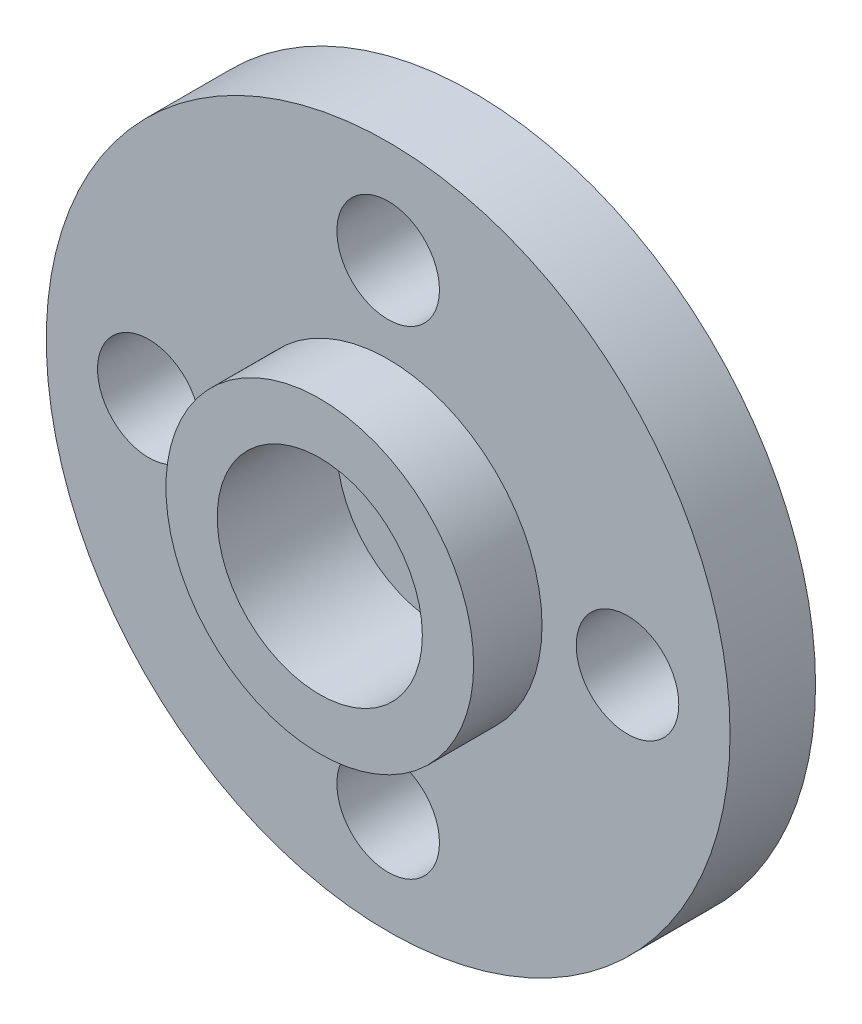
ISO-10303-21;
HEADER;
FILE_DESCRIPTION(('STEP AP214'),'2;1');
FILE_NAME('part.step','',(''),(''),'','','');
FILE_SCHEMA(('AUTOMOTIVE_DESIGN { 1 0 10303 214 1 1 1 1 }'));
ENDSEC;
DATA;
#1=APPLICATION_CONTEXT('core data for automotive mechanical design processes');
#2=APPLICATION_PROTOCOL_DEFINITION('international standard','automotive_design',2000,#1);
#3=PRODUCT_CONTEXT('',#1,'mechanical');
#4=PRODUCT('Part','Part','',(#3));
#5=PRODUCT_RELATED_PRODUCT_CATEGORY('part','',(#4));
#6=PRODUCT_DEFINITION_FORMATION('','',#4);
#7=PRODUCT_DEFINITION_CONTEXT('part definition',#1,'design');
#8=PRODUCT_DEFINITION('design','',#6,#7);
#9=PRODUCT_DEFINITION_SHAPE('','',#8);
#10=(LENGTH_UNIT() NAMED_UNIT(*) SI_UNIT(.MILLI.,.METRE.));
#11=(NAMED_UNIT(*) PLANE_ANGLE_UNIT() SI_UNIT($,.RADIAN.));
#12=(NAMED_UNIT(*) SI_UNIT($,.STERADIAN.) SOLID_ANGLE_UNIT());
#13=UNCERTAINTY_MEASURE_WITH_UNIT(LENGTH_MEASURE(1.E-05),#10,'distance_accuracy_value','');
#14=(GEOMETRIC_REPRESENTATION_CONTEXT(3) GLOBAL_UNCERTAINTY_ASSIGNED_CONTEXT((#13)) GLOBAL_UNIT_ASSIGNED_CONTEXT((#10,
#11,#12)) REPRESENTATION_CONTEXT('',''));
#15=CARTESIAN_POINT('',(0.,0.,0.));
#16=DIRECTION('',(0.,0.,1.));
#17=DIRECTION('',(1.,0.,0.));
#18=AXIS2_PLACEMENT_3D('',#15,#16,#17);
#19=CARTESIAN_POINT('',(0.,0.,-10.5));
#20=DIRECTION('',(0.,0.,1.));
#21=DIRECTION('',(1.,0.,0.));
#22=AXIS2_PLACEMENT_3D('',#19,#20,#21);
#23=CYLINDRICAL_SURFACE('',#22,1.5);
#24=CARTESIAN_POINT('',(0.,0.,0.));
#25=DIRECTION('',(0.,0.,1.));
#26=DIRECTION('',(1.,0.,0.));
#27=AXIS2_PLACEMENT_3D('',#24,#25,#26);
#28=CIRCLE('',#27,1.5);
#29=CARTESIAN_POINT('',(1.5,0.,0.));
#30=VERTEX_POINT('',#29);
#31=EDGE_CURVE('E54',#30,#30,#28,.T.);
#32=ORIENTED_EDGE('',*,*,#31,.F.);
#33=EDGE_LOOP('',(#32));
#34=FACE_BOUND('',#33,.T.);
#35=CARTESIAN_POINT('',(0.,0.,1.));
#36=DIRECTION('',(0.,0.,1.));
#37=DIRECTION('',(1.,0.,0.));
#38=AXIS2_PLACEMENT_3D('',#35,#36,#37);
#39=CIRCLE('',#38,1.5);
#40=CARTESIAN_POINT('',(1.5,0.,1.));
#41=VERTEX_POINT('',#40);
#42=EDGE_CURVE('E36',#41,#41,#39,.F.);
#43=ORIENTED_EDGE('',*,*,#42,.F.);
#44=EDGE_LOOP('',(#43));
#45=FACE_BOUND('',#44,.T.);
#46=ADVANCED_FACE('F32',(#34,#45),#23,.F.);
#47=CARTESIAN_POINT('',(0.,0.,2.5));
#48=DIRECTION('',(0.,0.,-1.));
#49=DIRECTION('',(-1.,0.,0.));
#50=AXIS2_PLACEMENT_3D('',#47,#48,#49);
#51=CYLINDRICAL_SURFACE('',#50,10.);
#52=CARTESIAN_POINT('',(0.,0.,2.5));
#53=DIRECTION('',(0.,0.,1.));
#54=DIRECTION('',(1.,0.,0.));
#55=AXIS2_PLACEMENT_3D('',#52,#53,#54);
#56=CIRCLE('',#55,10.);
#57=CARTESIAN_POINT('',(10.,0.,2.5));
#58=VERTEX_POINT('',#57);
#59=EDGE_CURVE('E10',#58,#58,#56,.T.);
#60=ORIENTED_EDGE('',*,*,#59,.F.);
#61=EDGE_LOOP('',(#60));
#62=FACE_BOUND('',#61,.T.);
#63=CARTESIAN_POINT('',(0.,0.,0.));
#64=DIRECTION('',(0.,0.,1.));
#65=DIRECTION('',(1.,0.,0.));
#66=AXIS2_PLACEMENT_3D('',#63,#64,#65);
#67=CIRCLE('',#66,10.);
#68=CARTESIAN_POINT('',(10.,0.,0.));
#69=VERTEX_POINT('',#68);
#70=EDGE_CURVE('E40',#69,#69,#67,.T.);
#71=ORIENTED_EDGE('',*,*,#70,.T.);
#72=EDGE_LOOP('',(#71));
#73=FACE_BOUND('',#72,.T.);
#74=ADVANCED_FACE('F34',(#62,#73),#51,.T.);
#75=CARTESIAN_POINT('',(0.,0.,2.5));
#76=DIRECTION('',(0.,0.,1.));
#77=DIRECTION('',(1.,0.,0.));
#78=AXIS2_PLACEMENT_3D('',#75,#76,#77);
#79=PLANE('',#78);
#80=CARTESIAN_POINT('',(7.,0.,2.5));
#81=DIRECTION('',(0.,0.,1.));
#82=DIRECTION('',(1.,0.,0.));
#83=AXIS2_PLACEMENT_3D('',#80,#81,#82);
#84=CIRCLE('',#83,1.50000000000033);
#85=CARTESIAN_POINT('',(8.50000000000033,0.,2.5));
#86=VERTEX_POINT('',#85);
#87=EDGE_CURVE('E60',#86,#86,#84,.T.);
#88=ORIENTED_EDGE('',*,*,#87,.F.);
#89=EDGE_LOOP('',(#88));
#90=FACE_BOUND('',#89,.T.);
#91=CARTESIAN_POINT('',(0.,-7.,2.5));
#92=DIRECTION('',(0.,0.,1.));
#93=DIRECTION('',(1.,0.,0.));
#94=AXIS2_PLACEMENT_3D('',#91,#92,#93);
#95=CIRCLE('',#94,1.50000000000033);
#96=CARTESIAN_POINT('',(1.50000000000033,-7.,2.5));
#97=VERTEX_POINT('',#96);
#98=EDGE_CURVE('E212',#97,#97,#95,.T.);
#99=ORIENTED_EDGE('',*,*,#98,.F.);
#100=EDGE_LOOP('',(#99));
#101=FACE_BOUND('',#100,.T.);
#102=CARTESIAN_POINT('',(-7.,0.,2.5));
#103=DIRECTION('',(0.,0.,1.));
#104=DIRECTION('',(1.,0.,0.));
#105=AXIS2_PLACEMENT_3D('',#102,#103,#104);
#106=CIRCLE('',#105,1.50000000000033);
#107=CARTESIAN_POINT('',(-5.49999999999967,0.,2.5));
#108=VERTEX_POINT('',#107);
#109=EDGE_CURVE('E72',#108,#108,#106,.T.);
#110=ORIENTED_EDGE('',*,*,#109,.F.);
#111=EDGE_LOOP('',(#110));
#112=FACE_BOUND('',#111,.T.);
#113=CARTESIAN_POINT('',(0.,7.,2.5));
#114=DIRECTION('',(0.,0.,1.));
#115=DIRECTION('',(1.,0.,0.));
#116=AXIS2_PLACEMENT_3D('',#113,#114,#115);
#117=CIRCLE('',#116,1.50000000000033);
#118=CARTESIAN_POINT('',(1.50000000000033,7.,2.5));
#119=VERTEX_POINT('',#118);
#120=EDGE_CURVE('E55',#119,#119,#117,.T.);
#121=ORIENTED_EDGE('',*,*,#120,.F.);
#122=EDGE_LOOP('',(#121));
#123=FACE_BOUND('',#122,.T.);
#124=CARTESIAN_POINT('',(0.,0.,2.5));
#125=DIRECTION('',(0.,0.,1.));
#126=DIRECTION('',(1.,0.,0.));
#127=AXIS2_PLACEMENT_3D('',#124,#125,#126);
#128=CIRCLE('',#127,4.5);
#129=CARTESIAN_POINT('',(4.5,0.,2.5));
#130=VERTEX_POINT('',#129);
#131=EDGE_CURVE('E48',#130,#130,#128,.T.);
#132=ORIENTED_EDGE('',*,*,#131,.F.);
#133=EDGE_LOOP('',(#132));
#134=FACE_BOUND('',#133,.T.);
#135=ORIENTED_EDGE('',*,*,#59,.T.);
#136=EDGE_LOOP('',(#135));
#137=FACE_BOUND('',#136,.T.);
#138=ADVANCED_FACE('F86',(#90,#101,#112,#123,#134,#137),#79,.T.);
#139=CARTESIAN_POINT('',(0.,0.,0.));
#140=DIRECTION('',(0.,0.,1.));
#141=DIRECTION('',(1.,0.,0.));
#142=AXIS2_PLACEMENT_3D('',#139,#140,#141);
#143=PLANE('',#142);
#144=CARTESIAN_POINT('',(7.,0.,0.));
#145=DIRECTION('',(0.,0.,1.));
#146=DIRECTION('',(1.,0.,0.));
#147=AXIS2_PLACEMENT_3D('',#144,#145,#146);
#148=CIRCLE('',#147,1.50000000000033);
#149=CARTESIAN_POINT('',(8.50000000000033,0.,0.));
#150=VERTEX_POINT('',#149);
#151=EDGE_CURVE('E62',#150,#150,#148,.T.);
#152=ORIENTED_EDGE('',*,*,#151,.T.);
#153=EDGE_LOOP('',(#152));
#154=FACE_BOUND('',#153,.T.);
#155=CARTESIAN_POINT('',(0.,-7.,0.));
#156=DIRECTION('',(0.,0.,1.));
#157=DIRECTION('',(1.,0.,0.));
#158=AXIS2_PLACEMENT_3D('',#155,#156,#157);
#159=CIRCLE('',#158,1.50000000000033);
#160=CARTESIAN_POINT('',(1.50000000000033,-7.,0.));
#161=VERTEX_POINT('',#160);
#162=EDGE_CURVE('E59',#161,#161,#159,.T.);
#163=ORIENTED_EDGE('',*,*,#162,.T.);
#164=EDGE_LOOP('',(#163));
#165=FACE_BOUND('',#164,.T.);
#166=CARTESIAN_POINT('',(-7.,0.,0.));
#167=DIRECTION('',(0.,0.,1.));
#168=DIRECTION('',(1.,0.,0.));
#169=AXIS2_PLACEMENT_3D('',#166,#167,#168);
#170=CIRCLE('',#169,1.50000000000033);
#171=CARTESIAN_POINT('',(-5.49999999999967,0.,0.));
#172=VERTEX_POINT('',#171);
#173=EDGE_CURVE('E56',#172,#172,#170,.T.);
#174=ORIENTED_EDGE('',*,*,#173,.T.);
#175=EDGE_LOOP('',(#174));
#176=FACE_BOUND('',#175,.T.);
#177=CARTESIAN_POINT('',(0.,7.,0.));
#178=DIRECTION('',(0.,0.,1.));
#179=DIRECTION('',(1.,0.,0.));
#180=AXIS2_PLACEMENT_3D('',#177,#178,#179);
#181=CIRCLE('',#180,1.50000000000033);
#182=CARTESIAN_POINT('',(1.50000000000033,7.,0.));
#183=VERTEX_POINT('',#182);
#184=EDGE_CURVE('E51',#183,#183,#181,.T.);
#185=ORIENTED_EDGE('',*,*,#184,.T.);
#186=EDGE_LOOP('',(#185));
#187=FACE_BOUND('',#186,.T.);
#188=ORIENTED_EDGE('',*,*,#31,.T.);
#189=EDGE_LOOP('',(#188));
#190=FACE_BOUND('',#189,.T.);
#191=ORIENTED_EDGE('',*,*,#70,.F.);
#192=EDGE_LOOP('',(#191));
#193=FACE_BOUND('',#192,.T.);
#194=ADVANCED_FACE('F88',(#154,#165,#176,#187,#190,#193),#143,.F.);
#195=CARTESIAN_POINT('',(0.,0.,4.5));
#196=DIRECTION('',(0.,0.,1.));
#197=DIRECTION('',(1.,0.,0.));
#198=AXIS2_PLACEMENT_3D('',#195,#196,#197);
#199=PLANE('',#198);
#200=CARTESIAN_POINT('',(0.,0.,4.5));
#201=DIRECTION('',(0.,0.,1.));
#202=DIRECTION('',(1.,0.,0.));
#203=AXIS2_PLACEMENT_3D('',#200,#201,#202);
#204=CIRCLE('',#203,4.5);
#205=CARTESIAN_POINT('',(4.5,0.,4.5));
#206=VERTEX_POINT('',#205);
#207=EDGE_CURVE('E45',#206,#206,#204,.T.);
#208=ORIENTED_EDGE('',*,*,#207,.T.);
#209=EDGE_LOOP('',(#208));
#210=FACE_BOUND('',#209,.T.);
#211=CARTESIAN_POINT('',(0.,0.,4.5));
#212=DIRECTION('',(0.,0.,1.));
#213=DIRECTION('',(1.,0.,0.));
#214=AXIS2_PLACEMENT_3D('',#211,#212,#213);
#215=CIRCLE('',#214,3.);
#216=CARTESIAN_POINT('',(3.,0.,4.5));
#217=VERTEX_POINT('',#216);
#218=EDGE_CURVE('E76',#217,#217,#215,.T.);
#219=ORIENTED_EDGE('',*,*,#218,.F.);
#220=EDGE_LOOP('',(#219));
#221=FACE_BOUND('',#220,.T.);
#222=ADVANCED_FACE('F95',(#210,#221),#199,.T.);
#223=CARTESIAN_POINT('',(0.,0.,4.5));
#224=DIRECTION('',(0.,0.,-1.));
#225=DIRECTION('',(-1.,0.,0.));
#226=AXIS2_PLACEMENT_3D('',#223,#224,#225);
#227=CYLINDRICAL_SURFACE('',#226,4.5);
#228=ORIENTED_EDGE('',*,*,#207,.F.);
#229=EDGE_LOOP('',(#228));
#230=FACE_BOUND('',#229,.T.);
#231=ORIENTED_EDGE('',*,*,#131,.T.);
#232=EDGE_LOOP('',(#231));
#233=FACE_BOUND('',#232,.T.);
#234=ADVANCED_FACE('F84',(#230,#233),#227,.T.);
#235=CARTESIAN_POINT('',(0.,0.,4.5));
#236=DIRECTION('',(0.,0.,-1.));
#237=DIRECTION('',(-1.,0.,0.));
#238=AXIS2_PLACEMENT_3D('',#235,#236,#237);
#239=CYLINDRICAL_SURFACE('',#238,3.);
#240=ORIENTED_EDGE('',*,*,#218,.T.);
#241=EDGE_LOOP('',(#240));
#242=FACE_BOUND('',#241,.T.);
#243=CARTESIAN_POINT('',(0.,0.,1.));
#244=DIRECTION('',(0.,0.,1.));
#245=DIRECTION('',(1.,0.,0.));
#246=AXIS2_PLACEMENT_3D('',#243,#244,#245);
#247=CIRCLE('',#246,3.);
#248=CARTESIAN_POINT('',(3.,0.,1.));
#249=VERTEX_POINT('',#248);
#250=EDGE_CURVE('E208',#249,#249,#247,.T.);
#251=ORIENTED_EDGE('',*,*,#250,.F.);
#252=EDGE_LOOP('',(#251));
#253=FACE_BOUND('',#252,.T.);
#254=ADVANCED_FACE('F111',(#242,#253),#239,.F.);
#255=CARTESIAN_POINT('',(0.,7.,-10.5));
#256=DIRECTION('',(0.,0.,1.));
#257=DIRECTION('',(1.,0.,0.));
#258=AXIS2_PLACEMENT_3D('',#255,#256,#257);
#259=CYLINDRICAL_SURFACE('',#258,1.50000000000033);
#260=ORIENTED_EDGE('',*,*,#120,.T.);
#261=EDGE_LOOP('',(#260));
#262=FACE_BOUND('',#261,.T.);
#263=ORIENTED_EDGE('',*,*,#184,.F.);
#264=EDGE_LOOP('',(#263));
#265=FACE_BOUND('',#264,.T.);
#266=ADVANCED_FACE('F109',(#262,#265),#259,.F.);
#267=CARTESIAN_POINT('',(-7.,0.,-10.5));
#268=DIRECTION('',(0.,0.,1.));
#269=DIRECTION('',(1.,0.,0.));
#270=AXIS2_PLACEMENT_3D('',#267,#268,#269);
#271=CYLINDRICAL_SURFACE('',#270,1.50000000000033);
#272=ORIENTED_EDGE('',*,*,#109,.T.);
#273=EDGE_LOOP('',(#272));
#274=FACE_BOUND('',#273,.T.);
#275=ORIENTED_EDGE('',*,*,#173,.F.);
#276=EDGE_LOOP('',(#275));
#277=FACE_BOUND('',#276,.T.);
#278=ADVANCED_FACE('F133',(#274,#277),#271,.F.);
#279=CARTESIAN_POINT('',(0.,-7.,-10.5));
#280=DIRECTION('',(0.,0.,1.));
#281=DIRECTION('',(1.,0.,0.));
#282=AXIS2_PLACEMENT_3D('',#279,#280,#281);
#283=CYLINDRICAL_SURFACE('',#282,1.50000000000033);
#284=ORIENTED_EDGE('',*,*,#98,.T.);
#285=EDGE_LOOP('',(#284));
#286=FACE_BOUND('',#285,.T.);
#287=ORIENTED_EDGE('',*,*,#162,.F.);
#288=EDGE_LOOP('',(#287));
#289=FACE_BOUND('',#288,.T.);
#290=ADVANCED_FACE('F140',(#286,#289),#283,.F.);
#291=CARTESIAN_POINT('',(7.,0.,-10.5));
#292=DIRECTION('',(0.,0.,1.));
#293=DIRECTION('',(1.,0.,0.));
#294=AXIS2_PLACEMENT_3D('',#291,#292,#293);
#295=CYLINDRICAL_SURFACE('',#294,1.50000000000033);
#296=ORIENTED_EDGE('',*,*,#87,.T.);
#297=EDGE_LOOP('',(#296));
#298=FACE_BOUND('',#297,.T.);
#299=ORIENTED_EDGE('',*,*,#151,.F.);
#300=EDGE_LOOP('',(#299));
#301=FACE_BOUND('',#300,.T.);
#302=ADVANCED_FACE('F147',(#298,#301),#295,.F.);
#303=CARTESIAN_POINT('',(0.,0.,1.));
#304=DIRECTION('',(0.,0.,1.));
#305=DIRECTION('',(1.,0.,0.));
#306=AXIS2_PLACEMENT_3D('',#303,#304,#305);
#307=PLANE('',#306);
#308=ORIENTED_EDGE('',*,*,#250,.T.);
#309=EDGE_LOOP('',(#308));
#310=FACE_BOUND('',#309,.T.);
#311=ORIENTED_EDGE('',*,*,#42,.T.);
#312=EDGE_LOOP('',(#311));
#313=FACE_BOUND('',#312,.T.);
#314=ADVANCED_FACE('F155',(#310,#313),#307,.T.);
#315=CLOSED_SHELL('',(#46,#74,#138,#194,#222,#234,#254,#266,#278,#290,#302,#314));
#316=MANIFOLD_SOLID_BREP('B2',#315);
#317=ADVANCED_BREP_SHAPE_REPRESENTATION('',(#18,#316),#14);
#318=SHAPE_DEFINITION_REPRESENTATION(#9,#317);
ENDSEC;
END-ISO-10303-21;
